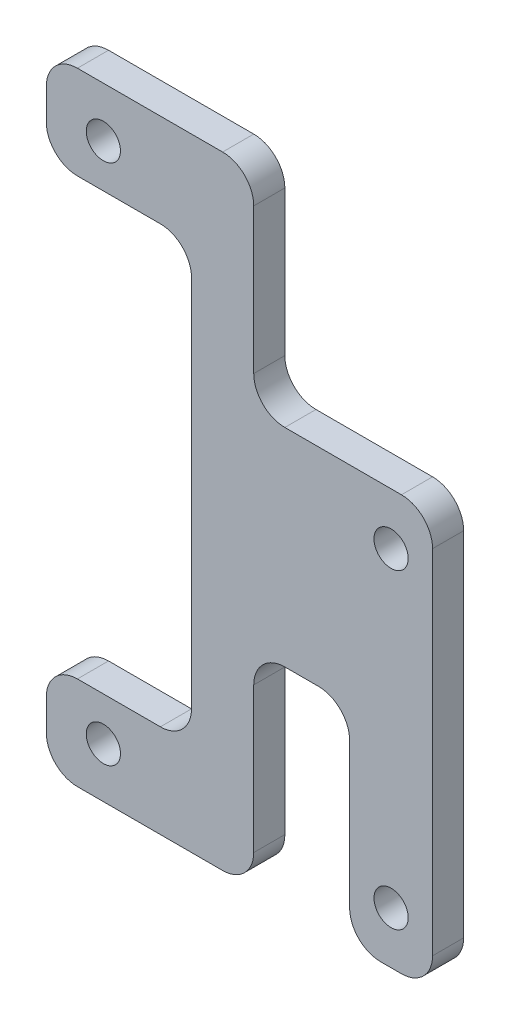
ISO-10303-21;
HEADER;
FILE_DESCRIPTION(('STEP AP214'),'2;1');
FILE_NAME('part.step','',(''),(''),'','','');
FILE_SCHEMA(('AUTOMOTIVE_DESIGN { 1 0 10303 214 1 1 1 1 }'));
ENDSEC;
DATA;
#1=APPLICATION_CONTEXT('core data for automotive mechanical design processes');
#2=APPLICATION_PROTOCOL_DEFINITION('international standard','automotive_design',2000,#1);
#3=PRODUCT_CONTEXT('',#1,'mechanical');
#4=PRODUCT('Part','Part','',(#3));
#5=PRODUCT_RELATED_PRODUCT_CATEGORY('part','',(#4));
#6=PRODUCT_DEFINITION_FORMATION('','',#4);
#7=PRODUCT_DEFINITION_CONTEXT('part definition',#1,'design');
#8=PRODUCT_DEFINITION('design','',#6,#7);
#9=PRODUCT_DEFINITION_SHAPE('','',#8);
#10=(LENGTH_UNIT() NAMED_UNIT(*) SI_UNIT(.MILLI.,.METRE.));
#11=(NAMED_UNIT(*) PLANE_ANGLE_UNIT() SI_UNIT($,.RADIAN.));
#12=(NAMED_UNIT(*) SI_UNIT($,.STERADIAN.) SOLID_ANGLE_UNIT());
#13=UNCERTAINTY_MEASURE_WITH_UNIT(LENGTH_MEASURE(1.E-05),#10,'distance_accuracy_value','');
#14=(GEOMETRIC_REPRESENTATION_CONTEXT(3) GLOBAL_UNCERTAINTY_ASSIGNED_CONTEXT((#13)) GLOBAL_UNIT_ASSIGNED_CONTEXT((#10,
#11,#12)) REPRESENTATION_CONTEXT('',''));
#15=CARTESIAN_POINT('',(0.,0.,0.));
#16=DIRECTION('',(0.,0.,1.));
#17=DIRECTION('',(1.,0.,0.));
#18=AXIS2_PLACEMENT_3D('',#15,#16,#17);
#19=CARTESIAN_POINT('',(-33.245,0.,0.));
#20=DIRECTION('',(-1.,0.,0.));
#21=DIRECTION('',(0.,-1.,0.));
#22=AXIS2_PLACEMENT_3D('',#19,#20,#21);
#23=PLANE('',#22);
#24=DIRECTION('',(0.,-1.,0.));
#25=VECTOR('',#24,1.);
#26=CARTESIAN_POINT('',(-33.245,40.,0.));
#27=LINE('',#26,#25);
#28=CARTESIAN_POINT('',(-33.245,37.,0.));
#29=VERTEX_POINT('',#28);
#30=CARTESIAN_POINT('',(-33.245,34.,0.));
#31=VERTEX_POINT('',#30);
#32=EDGE_CURVE('E429',#29,#31,#27,.T.);
#33=ORIENTED_EDGE('',*,*,#32,.T.);
#34=DIRECTION('',(0.,0.,-1.));
#35=VECTOR('',#34,1.);
#36=CARTESIAN_POINT('',(-33.245,34.,3.));
#37=LINE('',#36,#35);
#38=CARTESIAN_POINT('',(-33.245,34.,3.));
#39=VERTEX_POINT('',#38);
#40=EDGE_CURVE('E60',#31,#39,#37,.F.);
#41=ORIENTED_EDGE('',*,*,#40,.T.);
#42=DIRECTION('',(0.,1.,0.));
#43=VECTOR('',#42,1.);
#44=CARTESIAN_POINT('',(-33.245,40.,3.));
#45=LINE('',#44,#43);
#46=CARTESIAN_POINT('',(-33.245,37.,3.));
#47=VERTEX_POINT('',#46);
#48=EDGE_CURVE('E423',#39,#47,#45,.T.);
#49=ORIENTED_EDGE('',*,*,#48,.T.);
#50=DIRECTION('',(0.,0.,-1.));
#51=VECTOR('',#50,1.);
#52=CARTESIAN_POINT('',(-33.245,37.,0.));
#53=LINE('',#52,#51);
#54=EDGE_CURVE('E369',#47,#29,#53,.T.);
#55=ORIENTED_EDGE('',*,*,#54,.T.);
#56=EDGE_LOOP('',(#33,#41,#49,#55));
#57=FACE_BOUND('',#56,.T.);
#58=ADVANCED_FACE('F38',(#57),#23,.T.);
#59=CARTESIAN_POINT('',(-4.,20.,3.));
#60=DIRECTION('',(1.,0.,0.));
#61=DIRECTION('',(0.,1.,0.));
#62=AXIS2_PLACEMENT_3D('',#59,#60,#61);
#63=PLANE('',#62);
#64=DIRECTION('',(0.,-1.,0.));
#65=VECTOR('',#64,1.);
#66=CARTESIAN_POINT('',(-4.,20.,0.));
#67=LINE('',#66,#65);
#68=CARTESIAN_POINT('',(-4.,-3.,0.));
#69=VERTEX_POINT('',#68);
#70=CARTESIAN_POINT('',(-4.,-17.,0.));
#71=VERTEX_POINT('',#70);
#72=EDGE_CURVE('E256',#69,#71,#67,.T.);
#73=ORIENTED_EDGE('',*,*,#72,.T.);
#74=DIRECTION('',(0.,0.,-1.));
#75=VECTOR('',#74,1.);
#76=CARTESIAN_POINT('',(-4.,-17.,3.));
#77=LINE('',#76,#75);
#78=CARTESIAN_POINT('',(-4.,-17.,3.));
#79=VERTEX_POINT('',#78);
#80=EDGE_CURVE('E316',#71,#79,#77,.F.);
#81=ORIENTED_EDGE('',*,*,#80,.T.);
#82=DIRECTION('',(0.,-1.,0.));
#83=VECTOR('',#82,1.);
#84=CARTESIAN_POINT('',(-4.,20.,3.));
#85=LINE('',#84,#83);
#86=CARTESIAN_POINT('',(-4.,-3.,3.));
#87=VERTEX_POINT('',#86);
#88=EDGE_CURVE('E463',#87,#79,#85,.T.);
#89=ORIENTED_EDGE('',*,*,#88,.F.);
#90=DIRECTION('',(0.,0.,1.));
#91=VECTOR('',#90,1.);
#92=CARTESIAN_POINT('',(-4.,-3.,0.));
#93=LINE('',#92,#91);
#94=EDGE_CURVE('E314',#87,#69,#93,.F.);
#95=ORIENTED_EDGE('',*,*,#94,.T.);
#96=EDGE_LOOP('',(#73,#81,#89,#95));
#97=FACE_BOUND('',#96,.T.);
#98=ADVANCED_FACE('F477',(#97),#63,.F.);
#99=CARTESIAN_POINT('',(0.,0.,3.));
#100=DIRECTION('',(0.,0.,1.));
#101=DIRECTION('',(1.,0.,0.));
#102=AXIS2_PLACEMENT_3D('',#99,#100,#101);
#103=PLANE('',#102);
#104=CARTESIAN_POINT('',(-27.745,35.17,3.));
#105=DIRECTION('',(0.,0.,1.));
#106=DIRECTION('',(1.,0.,0.));
#107=AXIS2_PLACEMENT_3D('',#104,#105,#106);
#108=CIRCLE('',#107,1.65);
#109=CARTESIAN_POINT('',(-26.095,35.17,3.));
#110=VERTEX_POINT('',#109);
#111=EDGE_CURVE('E276',#110,#110,#108,.T.);
#112=ORIENTED_EDGE('',*,*,#111,.F.);
#113=EDGE_LOOP('',(#112));
#114=FACE_BOUND('',#113,.T.);
#115=CARTESIAN_POINT('',(-27.745,-15.17,3.));
#116=DIRECTION('',(0.,0.,1.));
#117=DIRECTION('',(-1.,0.,0.));
#118=AXIS2_PLACEMENT_3D('',#115,#116,#117);
#119=CIRCLE('',#118,1.65);
#120=CARTESIAN_POINT('',(-29.395,-15.17,3.));
#121=VERTEX_POINT('',#120);
#122=EDGE_CURVE('E531',#121,#121,#119,.T.);
#123=ORIENTED_EDGE('',*,*,#122,.F.);
#124=EDGE_LOOP('',(#123));
#125=FACE_BOUND('',#124,.T.);
#126=DIRECTION('',(1.,0.,0.));
#127=VECTOR('',#126,1.);
#128=CARTESIAN_POINT('',(-4.,-20.,3.));
#129=LINE('',#128,#127);
#130=CARTESIAN_POINT('',(-0.999999999999997,-20.,3.));
#131=VERTEX_POINT('',#130);
#132=CARTESIAN_POINT('',(1.,-20.,3.));
#133=VERTEX_POINT('',#132);
#134=EDGE_CURVE('E262',#131,#133,#129,.T.);
#135=ORIENTED_EDGE('',*,*,#134,.T.);
#136=CARTESIAN_POINT('',(1.,-17.,3.));
#137=DIRECTION('',(0.,0.,1.));
#138=DIRECTION('',(1.,0.,0.));
#139=AXIS2_PLACEMENT_3D('',#136,#137,#138);
#140=CIRCLE('',#139,3.);
#141=CARTESIAN_POINT('',(4.,-17.,3.));
#142=VERTEX_POINT('',#141);
#143=EDGE_CURVE('E312',#133,#142,#140,.T.);
#144=ORIENTED_EDGE('',*,*,#143,.T.);
#145=DIRECTION('',(0.,1.,0.));
#146=VECTOR('',#145,1.);
#147=CARTESIAN_POINT('',(4.,20.,3.));
#148=LINE('',#147,#146);
#149=CARTESIAN_POINT('',(4.,17.,3.));
#150=VERTEX_POINT('',#149);
#151=EDGE_CURVE('E244',#142,#150,#148,.T.);
#152=ORIENTED_EDGE('',*,*,#151,.T.);
#153=CARTESIAN_POINT('',(0.999999999999998,17.,3.));
#154=DIRECTION('',(0.,0.,1.));
#155=DIRECTION('',(1.,0.,0.));
#156=AXIS2_PLACEMENT_3D('',#153,#154,#155);
#157=CIRCLE('',#156,3.);
#158=CARTESIAN_POINT('',(0.999999999999998,20.,3.));
#159=VERTEX_POINT('',#158);
#160=EDGE_CURVE('E302',#150,#159,#157,.T.);
#161=ORIENTED_EDGE('',*,*,#160,.T.);
#162=DIRECTION('',(-1.,0.,0.));
#163=VECTOR('',#162,1.);
#164=CARTESIAN_POINT('',(-4.,20.,3.));
#165=LINE('',#164,#163);
#166=CARTESIAN_POINT('',(-10.245,20.,3.));
#167=VERTEX_POINT('',#166);
#168=EDGE_CURVE('E461',#159,#167,#165,.T.);
#169=ORIENTED_EDGE('',*,*,#168,.T.);
#170=CARTESIAN_POINT('',(-10.245,23.,3.));
#171=DIRECTION('',(0.,0.,1.));
#172=DIRECTION('',(1.,0.,0.));
#173=AXIS2_PLACEMENT_3D('',#170,#171,#172);
#174=CIRCLE('',#173,3.);
#175=CARTESIAN_POINT('',(-13.245,23.,3.));
#176=VERTEX_POINT('',#175);
#177=EDGE_CURVE('E387',#167,#176,#174,.F.);
#178=ORIENTED_EDGE('',*,*,#177,.T.);
#179=DIRECTION('',(0.,1.,0.));
#180=VECTOR('',#179,1.);
#181=CARTESIAN_POINT('',(-13.245,40.,3.));
#182=LINE('',#181,#180);
#183=CARTESIAN_POINT('',(-13.245,37.,3.));
#184=VERTEX_POINT('',#183);
#185=EDGE_CURVE('E413',#176,#184,#182,.T.);
#186=ORIENTED_EDGE('',*,*,#185,.T.);
#187=CARTESIAN_POINT('',(-16.245,37.,3.));
#188=DIRECTION('',(0.,0.,1.));
#189=DIRECTION('',(1.,0.,0.));
#190=AXIS2_PLACEMENT_3D('',#187,#188,#189);
#191=CIRCLE('',#190,3.);
#192=CARTESIAN_POINT('',(-16.245,40.,3.));
#193=VERTEX_POINT('',#192);
#194=EDGE_CURVE('E300',#184,#193,#191,.T.);
#195=ORIENTED_EDGE('',*,*,#194,.T.);
#196=DIRECTION('',(1.,0.,0.));
#197=VECTOR('',#196,1.);
#198=CARTESIAN_POINT('',(-33.245,40.,3.));
#199=LINE('',#198,#197);
#200=CARTESIAN_POINT('',(-30.245,40.,3.));
#201=VERTEX_POINT('',#200);
#202=EDGE_CURVE('E443',#201,#193,#199,.T.);
#203=ORIENTED_EDGE('',*,*,#202,.F.);
#204=CARTESIAN_POINT('',(-30.245,37.,3.));
#205=DIRECTION('',(0.,0.,1.));
#206=DIRECTION('',(1.,0.,0.));
#207=AXIS2_PLACEMENT_3D('',#204,#205,#206);
#208=CIRCLE('',#207,3.);
#209=EDGE_CURVE('E53',#201,#47,#208,.T.);
#210=ORIENTED_EDGE('',*,*,#209,.T.);
#211=ORIENTED_EDGE('',*,*,#48,.F.);
#212=CARTESIAN_POINT('',(-30.245,34.,3.));
#213=DIRECTION('',(0.,0.,1.));
#214=DIRECTION('',(1.,0.,0.));
#215=AXIS2_PLACEMENT_3D('',#212,#213,#214);
#216=CIRCLE('',#215,3.);
#217=CARTESIAN_POINT('',(-30.245,31.,3.));
#218=VERTEX_POINT('',#217);
#219=EDGE_CURVE('E298',#39,#218,#216,.T.);
#220=ORIENTED_EDGE('',*,*,#219,.T.);
#221=DIRECTION('',(-1.,0.,0.));
#222=VECTOR('',#221,1.);
#223=CARTESIAN_POINT('',(-33.245,31.,3.));
#224=LINE('',#223,#222);
#225=CARTESIAN_POINT('',(-22.245,31.,3.));
#226=VERTEX_POINT('',#225);
#227=EDGE_CURVE('E396',#226,#218,#224,.T.);
#228=ORIENTED_EDGE('',*,*,#227,.F.);
#229=CARTESIAN_POINT('',(-22.245,28.,3.));
#230=DIRECTION('',(0.,0.,1.));
#231=DIRECTION('',(1.,0.,0.));
#232=AXIS2_PLACEMENT_3D('',#229,#230,#231);
#233=CIRCLE('',#232,3.);
#234=CARTESIAN_POINT('',(-19.245,28.,3.));
#235=VERTEX_POINT('',#234);
#236=EDGE_CURVE('E46',#226,#235,#233,.F.);
#237=ORIENTED_EDGE('',*,*,#236,.T.);
#238=DIRECTION('',(0.,1.,0.));
#239=VECTOR('',#238,1.);
#240=CARTESIAN_POINT('',(-19.245,31.,3.));
#241=LINE('',#240,#239);
#242=CARTESIAN_POINT('',(-19.245,-7.99999999999996,3.));
#243=VERTEX_POINT('',#242);
#244=EDGE_CURVE('E394',#243,#235,#241,.T.);
#245=ORIENTED_EDGE('',*,*,#244,.F.);
#246=CARTESIAN_POINT('',(-22.245,-7.99999999999997,3.));
#247=DIRECTION('',(0.,0.,1.));
#248=DIRECTION('',(1.,0.,0.));
#249=AXIS2_PLACEMENT_3D('',#246,#247,#248);
#250=CIRCLE('',#249,3.);
#251=CARTESIAN_POINT('',(-22.245,-11.,3.));
#252=VERTEX_POINT('',#251);
#253=EDGE_CURVE('E381',#243,#252,#250,.F.);
#254=ORIENTED_EDGE('',*,*,#253,.T.);
#255=DIRECTION('',(1.,0.,0.));
#256=VECTOR('',#255,1.);
#257=CARTESIAN_POINT('',(-33.245,-11.,3.));
#258=LINE('',#257,#256);
#259=CARTESIAN_POINT('',(-30.245,-11.,3.));
#260=VERTEX_POINT('',#259);
#261=EDGE_CURVE('E279',#260,#252,#258,.T.);
#262=ORIENTED_EDGE('',*,*,#261,.F.);
#263=CARTESIAN_POINT('',(-30.245,-14.,3.));
#264=DIRECTION('',(0.,0.,1.));
#265=DIRECTION('',(1.,0.,0.));
#266=AXIS2_PLACEMENT_3D('',#263,#264,#265);
#267=CIRCLE('',#266,3.);
#268=CARTESIAN_POINT('',(-33.245,-14.,3.));
#269=VERTEX_POINT('',#268);
#270=EDGE_CURVE('E304',#260,#269,#267,.T.);
#271=ORIENTED_EDGE('',*,*,#270,.T.);
#272=CARTESIAN_POINT('',(-33.245,-17.,3.));
#273=VERTEX_POINT('',#272);
#274=EDGE_CURVE('E425',#273,#269,#45,.T.);
#275=ORIENTED_EDGE('',*,*,#274,.F.);
#276=CARTESIAN_POINT('',(-30.245,-17.,3.));
#277=DIRECTION('',(0.,0.,1.));
#278=DIRECTION('',(1.,0.,0.));
#279=AXIS2_PLACEMENT_3D('',#276,#277,#278);
#280=CIRCLE('',#279,3.);
#281=CARTESIAN_POINT('',(-30.245,-20.,3.));
#282=VERTEX_POINT('',#281);
#283=EDGE_CURVE('E306',#273,#282,#280,.T.);
#284=ORIENTED_EDGE('',*,*,#283,.T.);
#285=DIRECTION('',(1.,0.,0.));
#286=VECTOR('',#285,1.);
#287=CARTESIAN_POINT('',(-33.245,-20.,3.));
#288=LINE('',#287,#286);
#289=CARTESIAN_POINT('',(-16.245,-20.,3.));
#290=VERTEX_POINT('',#289);
#291=EDGE_CURVE('E434',#282,#290,#288,.T.);
#292=ORIENTED_EDGE('',*,*,#291,.T.);
#293=CARTESIAN_POINT('',(-16.245,-17.,3.));
#294=DIRECTION('',(0.,0.,1.));
#295=DIRECTION('',(1.,0.,0.));
#296=AXIS2_PLACEMENT_3D('',#293,#294,#295);
#297=CIRCLE('',#296,3.);
#298=CARTESIAN_POINT('',(-13.245,-17.,3.));
#299=VERTEX_POINT('',#298);
#300=EDGE_CURVE('E308',#290,#299,#297,.T.);
#301=ORIENTED_EDGE('',*,*,#300,.T.);
#302=CARTESIAN_POINT('',(-13.245,-3.,3.));
#303=VERTEX_POINT('',#302);
#304=EDGE_CURVE('E417',#299,#303,#182,.T.);
#305=ORIENTED_EDGE('',*,*,#304,.T.);
#306=CARTESIAN_POINT('',(-10.245,-3.,3.));
#307=DIRECTION('',(0.,0.,1.));
#308=DIRECTION('',(1.,0.,0.));
#309=AXIS2_PLACEMENT_3D('',#306,#307,#308);
#310=CIRCLE('',#309,3.);
#311=CARTESIAN_POINT('',(-10.245,0.,3.));
#312=VERTEX_POINT('',#311);
#313=EDGE_CURVE('E377',#303,#312,#310,.F.);
#314=ORIENTED_EDGE('',*,*,#313,.T.);
#315=DIRECTION('',(1.,0.,0.));
#316=VECTOR('',#315,1.);
#317=CARTESIAN_POINT('',(-13.245,0.,3.));
#318=LINE('',#317,#316);
#319=CARTESIAN_POINT('',(-7.,0.,3.));
#320=VERTEX_POINT('',#319);
#321=EDGE_CURVE('E446',#312,#320,#318,.T.);
#322=ORIENTED_EDGE('',*,*,#321,.T.);
#323=CARTESIAN_POINT('',(-7.,-3.,3.));
#324=DIRECTION('',(0.,0.,1.));
#325=DIRECTION('',(1.,0.,0.));
#326=AXIS2_PLACEMENT_3D('',#323,#324,#325);
#327=CIRCLE('',#326,3.);
#328=EDGE_CURVE('E373',#320,#87,#327,.F.);
#329=ORIENTED_EDGE('',*,*,#328,.T.);
#330=ORIENTED_EDGE('',*,*,#88,.T.);
#331=CARTESIAN_POINT('',(-0.999999999999997,-17.,3.));
#332=DIRECTION('',(0.,0.,1.));
#333=DIRECTION('',(1.,0.,0.));
#334=AXIS2_PLACEMENT_3D('',#331,#332,#333);
#335=CIRCLE('',#334,3.);
#336=EDGE_CURVE('E310',#79,#131,#335,.T.);
#337=ORIENTED_EDGE('',*,*,#336,.T.);
#338=EDGE_LOOP('',(#135,#144,#152,#161,#169,#178,#186,#195,#203,#210,#211,#220,#228,#237,#245,
#254,#262,#271,#275,#284,#292,#301,#305,#314,#322,#329,#330,#337));
#339=FACE_BOUND('',#338,.T.);
#340=CARTESIAN_POINT('',(0.,15.,3.));
#341=DIRECTION('',(0.,0.,1.));
#342=DIRECTION('',(1.,0.,0.));
#343=AXIS2_PLACEMENT_3D('',#340,#341,#342);
#344=CIRCLE('',#343,1.65);
#345=CARTESIAN_POINT('',(1.65,15.,3.));
#346=VERTEX_POINT('',#345);
#347=EDGE_CURVE('E253',#346,#346,#344,.T.);
#348=ORIENTED_EDGE('',*,*,#347,.F.);
#349=EDGE_LOOP('',(#348));
#350=FACE_BOUND('',#349,.T.);
#351=CARTESIAN_POINT('',(0.,-15.,3.));
#352=DIRECTION('',(0.,0.,1.));
#353=DIRECTION('',(-1.,0.,0.));
#354=AXIS2_PLACEMENT_3D('',#351,#352,#353);
#355=CIRCLE('',#354,1.65);
#356=CARTESIAN_POINT('',(-1.65,-15.,3.));
#357=VERTEX_POINT('',#356);
#358=EDGE_CURVE('E453',#357,#357,#355,.T.);
#359=ORIENTED_EDGE('',*,*,#358,.F.);
#360=EDGE_LOOP('',(#359));
#361=FACE_BOUND('',#360,.T.);
#362=ADVANCED_FACE('F392',(#114,#125,#339,#350,#361),#103,.T.);
#363=CARTESIAN_POINT('',(0.,0.,0.));
#364=DIRECTION('',(0.,0.,1.));
#365=DIRECTION('',(1.,0.,0.));
#366=AXIS2_PLACEMENT_3D('',#363,#364,#365);
#367=PLANE('',#366);
#368=CARTESIAN_POINT('',(-27.745,35.17,0.));
#369=DIRECTION('',(0.,0.,1.));
#370=DIRECTION('',(1.,0.,0.));
#371=AXIS2_PLACEMENT_3D('',#368,#369,#370);
#372=CIRCLE('',#371,1.65);
#373=CARTESIAN_POINT('',(-26.095,35.17,0.));
#374=VERTEX_POINT('',#373);
#375=EDGE_CURVE('E275',#374,#374,#372,.T.);
#376=ORIENTED_EDGE('',*,*,#375,.T.);
#377=EDGE_LOOP('',(#376));
#378=FACE_BOUND('',#377,.T.);
#379=CARTESIAN_POINT('',(-27.745,-15.17,0.));
#380=DIRECTION('',(0.,0.,1.));
#381=DIRECTION('',(1.,0.,0.));
#382=AXIS2_PLACEMENT_3D('',#379,#380,#381);
#383=CIRCLE('',#382,1.65);
#384=CARTESIAN_POINT('',(-26.095,-15.17,0.));
#385=VERTEX_POINT('',#384);
#386=EDGE_CURVE('E272',#385,#385,#383,.T.);
#387=ORIENTED_EDGE('',*,*,#386,.T.);
#388=EDGE_LOOP('',(#387));
#389=FACE_BOUND('',#388,.T.);
#390=DIRECTION('',(0.,1.,0.));
#391=VECTOR('',#390,1.);
#392=CARTESIAN_POINT('',(4.,20.,0.));
#393=LINE('',#392,#391);
#394=CARTESIAN_POINT('',(4.,-17.,0.));
#395=VERTEX_POINT('',#394);
#396=CARTESIAN_POINT('',(4.,17.,0.));
#397=VERTEX_POINT('',#396);
#398=EDGE_CURVE('E241',#395,#397,#393,.T.);
#399=ORIENTED_EDGE('',*,*,#398,.F.);
#400=CARTESIAN_POINT('',(1.,-17.,0.));
#401=DIRECTION('',(0.,0.,1.));
#402=DIRECTION('',(1.,0.,0.));
#403=AXIS2_PLACEMENT_3D('',#400,#401,#402);
#404=CIRCLE('',#403,3.);
#405=CARTESIAN_POINT('',(1.,-20.,0.));
#406=VERTEX_POINT('',#405);
#407=EDGE_CURVE('E224',#395,#406,#404,.F.);
#408=ORIENTED_EDGE('',*,*,#407,.T.);
#409=DIRECTION('',(1.,0.,0.));
#410=VECTOR('',#409,1.);
#411=CARTESIAN_POINT('',(-4.,-20.,0.));
#412=LINE('',#411,#410);
#413=CARTESIAN_POINT('',(-0.999999999999997,-20.,0.));
#414=VERTEX_POINT('',#413);
#415=EDGE_CURVE('E267',#414,#406,#412,.T.);
#416=ORIENTED_EDGE('',*,*,#415,.F.);
#417=CARTESIAN_POINT('',(-0.999999999999997,-17.,0.));
#418=DIRECTION('',(0.,0.,1.));
#419=DIRECTION('',(1.,0.,0.));
#420=AXIS2_PLACEMENT_3D('',#417,#418,#419);
#421=CIRCLE('',#420,3.);
#422=EDGE_CURVE('E235',#414,#71,#421,.F.);
#423=ORIENTED_EDGE('',*,*,#422,.T.);
#424=ORIENTED_EDGE('',*,*,#72,.F.);
#425=CARTESIAN_POINT('',(-7.,-3.,0.));
#426=DIRECTION('',(0.,0.,1.));
#427=DIRECTION('',(1.,0.,0.));
#428=AXIS2_PLACEMENT_3D('',#425,#426,#427);
#429=CIRCLE('',#428,3.);
#430=CARTESIAN_POINT('',(-7.,0.,0.));
#431=VERTEX_POINT('',#430);
#432=EDGE_CURVE('E375',#69,#431,#429,.T.);
#433=ORIENTED_EDGE('',*,*,#432,.T.);
#434=DIRECTION('',(1.,0.,0.));
#435=VECTOR('',#434,1.);
#436=CARTESIAN_POINT('',(-13.245,0.,0.));
#437=LINE('',#436,#435);
#438=CARTESIAN_POINT('',(-10.245,0.,0.));
#439=VERTEX_POINT('',#438);
#440=EDGE_CURVE('E449',#439,#431,#437,.T.);
#441=ORIENTED_EDGE('',*,*,#440,.F.);
#442=CARTESIAN_POINT('',(-10.245,-3.,0.));
#443=DIRECTION('',(0.,0.,1.));
#444=DIRECTION('',(1.,0.,0.));
#445=AXIS2_PLACEMENT_3D('',#442,#443,#444);
#446=CIRCLE('',#445,3.);
#447=CARTESIAN_POINT('',(-13.245,-3.,0.));
#448=VERTEX_POINT('',#447);
#449=EDGE_CURVE('E379',#439,#448,#446,.T.);
#450=ORIENTED_EDGE('',*,*,#449,.T.);
#451=DIRECTION('',(0.,-1.,0.));
#452=VECTOR('',#451,1.);
#453=CARTESIAN_POINT('',(-13.245,40.,0.));
#454=LINE('',#453,#452);
#455=CARTESIAN_POINT('',(-13.245,-17.,0.));
#456=VERTEX_POINT('',#455);
#457=EDGE_CURVE('E431',#448,#456,#454,.T.);
#458=ORIENTED_EDGE('',*,*,#457,.T.);
#459=CARTESIAN_POINT('',(-16.245,-17.,0.));
#460=DIRECTION('',(0.,0.,1.));
#461=DIRECTION('',(1.,0.,0.));
#462=AXIS2_PLACEMENT_3D('',#459,#460,#461);
#463=CIRCLE('',#462,3.);
#464=CARTESIAN_POINT('',(-16.245,-20.,0.));
#465=VERTEX_POINT('',#464);
#466=EDGE_CURVE('E291',#456,#465,#463,.F.);
#467=ORIENTED_EDGE('',*,*,#466,.T.);
#468=DIRECTION('',(1.,0.,0.));
#469=VECTOR('',#468,1.);
#470=CARTESIAN_POINT('',(-33.245,-20.,0.));
#471=LINE('',#470,#469);
#472=CARTESIAN_POINT('',(-30.245,-20.,0.));
#473=VERTEX_POINT('',#472);
#474=EDGE_CURVE('E437',#473,#465,#471,.T.);
#475=ORIENTED_EDGE('',*,*,#474,.F.);
#476=CARTESIAN_POINT('',(-30.245,-17.,0.));
#477=DIRECTION('',(0.,0.,1.));
#478=DIRECTION('',(1.,0.,0.));
#479=AXIS2_PLACEMENT_3D('',#476,#477,#478);
#480=CIRCLE('',#479,3.);
#481=CARTESIAN_POINT('',(-33.245,-17.,0.));
#482=VERTEX_POINT('',#481);
#483=EDGE_CURVE('E289',#473,#482,#480,.F.);
#484=ORIENTED_EDGE('',*,*,#483,.T.);
#485=CARTESIAN_POINT('',(-33.245,-14.,0.));
#486=VERTEX_POINT('',#485);
#487=EDGE_CURVE('E427',#486,#482,#27,.T.);
#488=ORIENTED_EDGE('',*,*,#487,.F.);
#489=CARTESIAN_POINT('',(-30.245,-14.,0.));
#490=DIRECTION('',(0.,0.,1.));
#491=DIRECTION('',(1.,0.,0.));
#492=AXIS2_PLACEMENT_3D('',#489,#490,#491);
#493=CIRCLE('',#492,3.);
#494=CARTESIAN_POINT('',(-30.245,-11.,0.));
#495=VERTEX_POINT('',#494);
#496=EDGE_CURVE('E287',#486,#495,#493,.F.);
#497=ORIENTED_EDGE('',*,*,#496,.T.);
#498=DIRECTION('',(1.,0.,0.));
#499=VECTOR('',#498,1.);
#500=CARTESIAN_POINT('',(0.,-11.,0.));
#501=LINE('',#500,#499);
#502=CARTESIAN_POINT('',(-22.245,-11.,0.));
#503=VERTEX_POINT('',#502);
#504=EDGE_CURVE('E414',#495,#503,#501,.T.);
#505=ORIENTED_EDGE('',*,*,#504,.T.);
#506=CARTESIAN_POINT('',(-22.245,-7.99999999999997,0.));
#507=DIRECTION('',(0.,0.,1.));
#508=DIRECTION('',(1.,0.,0.));
#509=AXIS2_PLACEMENT_3D('',#506,#507,#508);
#510=CIRCLE('',#509,3.);
#511=CARTESIAN_POINT('',(-19.245,-7.99999999999997,0.));
#512=VERTEX_POINT('',#511);
#513=EDGE_CURVE('E383',#503,#512,#510,.T.);
#514=ORIENTED_EDGE('',*,*,#513,.T.);
#515=DIRECTION('',(0.,1.,0.));
#516=VECTOR('',#515,1.);
#517=CARTESIAN_POINT('',(-19.245,0.,0.));
#518=LINE('',#517,#516);
#519=CARTESIAN_POINT('',(-19.245,28.,0.));
#520=VERTEX_POINT('',#519);
#521=EDGE_CURVE('E269',#512,#520,#518,.T.);
#522=ORIENTED_EDGE('',*,*,#521,.T.);
#523=CARTESIAN_POINT('',(-22.245,28.,0.));
#524=DIRECTION('',(0.,0.,1.));
#525=DIRECTION('',(1.,0.,0.));
#526=AXIS2_PLACEMENT_3D('',#523,#524,#525);
#527=CIRCLE('',#526,3.);
#528=CARTESIAN_POINT('',(-22.245,31.,0.));
#529=VERTEX_POINT('',#528);
#530=EDGE_CURVE('E11',#520,#529,#527,.T.);
#531=ORIENTED_EDGE('',*,*,#530,.T.);
#532=DIRECTION('',(-1.,0.,0.));
#533=VECTOR('',#532,1.);
#534=CARTESIAN_POINT('',(0.,31.,0.));
#535=LINE('',#534,#533);
#536=CARTESIAN_POINT('',(-30.245,31.,0.));
#537=VERTEX_POINT('',#536);
#538=EDGE_CURVE('E409',#529,#537,#535,.T.);
#539=ORIENTED_EDGE('',*,*,#538,.T.);
#540=CARTESIAN_POINT('',(-30.245,34.,0.));
#541=DIRECTION('',(0.,0.,1.));
#542=DIRECTION('',(1.,0.,0.));
#543=AXIS2_PLACEMENT_3D('',#540,#541,#542);
#544=CIRCLE('',#543,3.);
#545=EDGE_CURVE('E282',#537,#31,#544,.F.);
#546=ORIENTED_EDGE('',*,*,#545,.T.);
#547=ORIENTED_EDGE('',*,*,#32,.F.);
#548=CARTESIAN_POINT('',(-30.245,37.,0.));
#549=DIRECTION('',(0.,0.,1.));
#550=DIRECTION('',(1.,0.,0.));
#551=AXIS2_PLACEMENT_3D('',#548,#549,#550);
#552=CIRCLE('',#551,3.);
#553=CARTESIAN_POINT('',(-30.245,40.,0.));
#554=VERTEX_POINT('',#553);
#555=EDGE_CURVE('E245',#29,#554,#552,.F.);
#556=ORIENTED_EDGE('',*,*,#555,.T.);
#557=DIRECTION('',(1.,0.,0.));
#558=VECTOR('',#557,1.);
#559=CARTESIAN_POINT('',(-33.245,40.,0.));
#560=LINE('',#559,#558);
#561=CARTESIAN_POINT('',(-16.245,40.,0.));
#562=VERTEX_POINT('',#561);
#563=EDGE_CURVE('E440',#554,#562,#560,.T.);
#564=ORIENTED_EDGE('',*,*,#563,.T.);
#565=CARTESIAN_POINT('',(-16.245,37.,0.));
#566=DIRECTION('',(0.,0.,1.));
#567=DIRECTION('',(1.,0.,0.));
#568=AXIS2_PLACEMENT_3D('',#565,#566,#567);
#569=CIRCLE('',#568,3.);
#570=CARTESIAN_POINT('',(-13.245,37.,0.));
#571=VERTEX_POINT('',#570);
#572=EDGE_CURVE('E284',#562,#571,#569,.F.);
#573=ORIENTED_EDGE('',*,*,#572,.T.);
#574=CARTESIAN_POINT('',(-13.245,23.,0.));
#575=VERTEX_POINT('',#574);
#576=EDGE_CURVE('E426',#571,#575,#454,.T.);
#577=ORIENTED_EDGE('',*,*,#576,.T.);
#578=CARTESIAN_POINT('',(-10.245,23.,0.));
#579=DIRECTION('',(0.,0.,1.));
#580=DIRECTION('',(1.,0.,0.));
#581=AXIS2_PLACEMENT_3D('',#578,#579,#580);
#582=CIRCLE('',#581,3.);
#583=CARTESIAN_POINT('',(-10.245,20.,0.));
#584=VERTEX_POINT('',#583);
#585=EDGE_CURVE('E385',#575,#584,#582,.T.);
#586=ORIENTED_EDGE('',*,*,#585,.T.);
#587=DIRECTION('',(-1.,0.,0.));
#588=VECTOR('',#587,1.);
#589=CARTESIAN_POINT('',(-4.,20.,0.));
#590=LINE('',#589,#588);
#591=CARTESIAN_POINT('',(0.999999999999998,20.,0.));
#592=VERTEX_POINT('',#591);
#593=EDGE_CURVE('E252',#592,#584,#590,.T.);
#594=ORIENTED_EDGE('',*,*,#593,.F.);
#595=CARTESIAN_POINT('',(0.999999999999998,17.,0.));
#596=DIRECTION('',(0.,0.,1.));
#597=DIRECTION('',(1.,0.,0.));
#598=AXIS2_PLACEMENT_3D('',#595,#596,#597);
#599=CIRCLE('',#598,3.);
#600=EDGE_CURVE('E251',#592,#397,#599,.F.);
#601=ORIENTED_EDGE('',*,*,#600,.T.);
#602=EDGE_LOOP('',(#399,#408,#416,#423,#424,#433,#441,#450,#458,#467,#475,#484,#488,#497,#505,
#514,#522,#531,#539,#546,#547,#556,#564,#573,#577,#586,#594,#601));
#603=FACE_BOUND('',#602,.T.);
#604=CARTESIAN_POINT('',(0.,15.,0.));
#605=DIRECTION('',(0.,0.,1.));
#606=DIRECTION('',(1.,0.,0.));
#607=AXIS2_PLACEMENT_3D('',#604,#605,#606);
#608=CIRCLE('',#607,1.65);
#609=CARTESIAN_POINT('',(1.65,15.,0.));
#610=VERTEX_POINT('',#609);
#611=EDGE_CURVE('E259',#610,#610,#608,.T.);
#612=ORIENTED_EDGE('',*,*,#611,.T.);
#613=EDGE_LOOP('',(#612));
#614=FACE_BOUND('',#613,.T.);
#615=CARTESIAN_POINT('',(0.,-15.,0.));
#616=DIRECTION('',(0.,0.,1.));
#617=DIRECTION('',(-1.,0.,0.));
#618=AXIS2_PLACEMENT_3D('',#615,#616,#617);
#619=CIRCLE('',#618,1.65);
#620=CARTESIAN_POINT('',(-1.65,-15.,0.));
#621=VERTEX_POINT('',#620);
#622=EDGE_CURVE('E452',#621,#621,#619,.T.);
#623=ORIENTED_EDGE('',*,*,#622,.T.);
#624=EDGE_LOOP('',(#623));
#625=FACE_BOUND('',#624,.T.);
#626=ADVANCED_FACE('F248',(#378,#389,#603,#614,#625),#367,.F.);
#627=CARTESIAN_POINT('',(4.,20.,3.));
#628=DIRECTION('',(-1.,0.,0.));
#629=DIRECTION('',(0.,-1.,0.));
#630=AXIS2_PLACEMENT_3D('',#627,#628,#629);
#631=PLANE('',#630);
#632=ORIENTED_EDGE('',*,*,#151,.F.);
#633=DIRECTION('',(0.,0.,-1.));
#634=VECTOR('',#633,1.);
#635=CARTESIAN_POINT('',(4.,-17.,3.));
#636=LINE('',#635,#634);
#637=EDGE_CURVE('E228',#142,#395,#636,.T.);
#638=ORIENTED_EDGE('',*,*,#637,.T.);
#639=ORIENTED_EDGE('',*,*,#398,.T.);
#640=DIRECTION('',(0.,0.,-1.));
#641=VECTOR('',#640,1.);
#642=CARTESIAN_POINT('',(4.,17.,3.));
#643=LINE('',#642,#641);
#644=EDGE_CURVE('E246',#397,#150,#643,.F.);
#645=ORIENTED_EDGE('',*,*,#644,.T.);
#646=EDGE_LOOP('',(#632,#638,#639,#645));
#647=FACE_BOUND('',#646,.T.);
#648=ADVANCED_FACE('F240',(#647),#631,.F.);
#649=CARTESIAN_POINT('',(-4.,20.,3.));
#650=DIRECTION('',(0.,-1.,0.));
#651=DIRECTION('',(0.,0.,-1.));
#652=AXIS2_PLACEMENT_3D('',#649,#650,#651);
#653=PLANE('',#652);
#654=ORIENTED_EDGE('',*,*,#168,.F.);
#655=DIRECTION('',(0.,0.,-1.));
#656=VECTOR('',#655,1.);
#657=CARTESIAN_POINT('',(0.999999999999998,20.,3.));
#658=LINE('',#657,#656);
#659=EDGE_CURVE('E350',#159,#592,#658,.T.);
#660=ORIENTED_EDGE('',*,*,#659,.T.);
#661=ORIENTED_EDGE('',*,*,#593,.T.);
#662=DIRECTION('',(0.,0.,-1.));
#663=VECTOR('',#662,1.);
#664=CARTESIAN_POINT('',(-10.245,20.,3.));
#665=LINE('',#664,#663);
#666=EDGE_CURVE('E348',#584,#167,#665,.F.);
#667=ORIENTED_EDGE('',*,*,#666,.T.);
#668=EDGE_LOOP('',(#654,#660,#661,#667));
#669=FACE_BOUND('',#668,.T.);
#670=ADVANCED_FACE('F560',(#669),#653,.F.);
#671=CARTESIAN_POINT('',(-4.,-20.,3.));
#672=DIRECTION('',(0.,1.,0.));
#673=DIRECTION('',(0.,0.,1.));
#674=AXIS2_PLACEMENT_3D('',#671,#672,#673);
#675=PLANE('',#674);
#676=ORIENTED_EDGE('',*,*,#415,.T.);
#677=DIRECTION('',(0.,0.,-1.));
#678=VECTOR('',#677,1.);
#679=CARTESIAN_POINT('',(1.,-20.,3.));
#680=LINE('',#679,#678);
#681=EDGE_CURVE('E229',#406,#133,#680,.F.);
#682=ORIENTED_EDGE('',*,*,#681,.T.);
#683=ORIENTED_EDGE('',*,*,#134,.F.);
#684=DIRECTION('',(0.,0.,-1.));
#685=VECTOR('',#684,1.);
#686=CARTESIAN_POINT('',(-0.999999999999997,-20.,3.));
#687=LINE('',#686,#685);
#688=EDGE_CURVE('E234',#131,#414,#687,.T.);
#689=ORIENTED_EDGE('',*,*,#688,.T.);
#690=EDGE_LOOP('',(#676,#682,#683,#689));
#691=FACE_BOUND('',#690,.T.);
#692=ADVANCED_FACE('F470',(#691),#675,.F.);
#693=CARTESIAN_POINT('',(0.,15.,3.));
#694=DIRECTION('',(0.,0.,-1.));
#695=DIRECTION('',(-1.,0.,0.));
#696=AXIS2_PLACEMENT_3D('',#693,#694,#695);
#697=CYLINDRICAL_SURFACE('',#696,1.65);
#698=ORIENTED_EDGE('',*,*,#347,.T.);
#699=EDGE_LOOP('',(#698));
#700=FACE_BOUND('',#699,.T.);
#701=ORIENTED_EDGE('',*,*,#611,.F.);
#702=EDGE_LOOP('',(#701));
#703=FACE_BOUND('',#702,.T.);
#704=ADVANCED_FACE('F598',(#700,#703),#697,.F.);
#705=CARTESIAN_POINT('',(0.,-15.,3.));
#706=DIRECTION('',(0.,0.,-1.));
#707=DIRECTION('',(-1.,0.,0.));
#708=AXIS2_PLACEMENT_3D('',#705,#706,#707);
#709=CYLINDRICAL_SURFACE('',#708,1.65);
#710=ORIENTED_EDGE('',*,*,#358,.T.);
#711=EDGE_LOOP('',(#710));
#712=FACE_BOUND('',#711,.T.);
#713=ORIENTED_EDGE('',*,*,#622,.F.);
#714=EDGE_LOOP('',(#713));
#715=FACE_BOUND('',#714,.T.);
#716=ADVANCED_FACE('F595',(#712,#715),#709,.F.);
#717=CARTESIAN_POINT('',(-13.245,0.,0.));
#718=DIRECTION('',(0.,1.,0.));
#719=DIRECTION('',(-1.,0.,0.));
#720=AXIS2_PLACEMENT_3D('',#717,#718,#719);
#721=PLANE('',#720);
#722=ORIENTED_EDGE('',*,*,#440,.T.);
#723=DIRECTION('',(0.,0.,1.));
#724=VECTOR('',#723,1.);
#725=CARTESIAN_POINT('',(-7.,0.,3.));
#726=LINE('',#725,#724);
#727=EDGE_CURVE('E320',#431,#320,#726,.T.);
#728=ORIENTED_EDGE('',*,*,#727,.T.);
#729=ORIENTED_EDGE('',*,*,#321,.F.);
#730=DIRECTION('',(0.,0.,1.));
#731=VECTOR('',#730,1.);
#732=CARTESIAN_POINT('',(-10.245,0.,0.));
#733=LINE('',#732,#731);
#734=EDGE_CURVE('E318',#312,#439,#733,.F.);
#735=ORIENTED_EDGE('',*,*,#734,.T.);
#736=EDGE_LOOP('',(#722,#728,#729,#735));
#737=FACE_BOUND('',#736,.T.);
#738=ADVANCED_FACE('F485',(#737),#721,.F.);
#739=CARTESIAN_POINT('',(-13.245,0.,0.));
#740=DIRECTION('',(-1.,0.,0.));
#741=DIRECTION('',(0.,-1.,0.));
#742=AXIS2_PLACEMENT_3D('',#739,#740,#741);
#743=PLANE('',#742);
#744=ORIENTED_EDGE('',*,*,#457,.F.);
#745=DIRECTION('',(0.,0.,1.));
#746=VECTOR('',#745,1.);
#747=CARTESIAN_POINT('',(-13.245,-3.,3.));
#748=LINE('',#747,#746);
#749=EDGE_CURVE('E325',#448,#303,#748,.T.);
#750=ORIENTED_EDGE('',*,*,#749,.T.);
#751=ORIENTED_EDGE('',*,*,#304,.F.);
#752=DIRECTION('',(0.,0.,1.));
#753=VECTOR('',#752,1.);
#754=CARTESIAN_POINT('',(-13.245,-17.,0.));
#755=LINE('',#754,#753);
#756=EDGE_CURVE('E323',#299,#456,#755,.F.);
#757=ORIENTED_EDGE('',*,*,#756,.T.);
#758=EDGE_LOOP('',(#744,#750,#751,#757));
#759=FACE_BOUND('',#758,.T.);
#760=ADVANCED_FACE('F494',(#759),#743,.F.);
#761=ORIENTED_EDGE('',*,*,#185,.F.);
#762=DIRECTION('',(0.,0.,-1.));
#763=VECTOR('',#762,1.);
#764=CARTESIAN_POINT('',(-13.245,23.,0.));
#765=LINE('',#764,#763);
#766=EDGE_CURVE('E355',#176,#575,#765,.T.);
#767=ORIENTED_EDGE('',*,*,#766,.T.);
#768=ORIENTED_EDGE('',*,*,#576,.F.);
#769=DIRECTION('',(0.,0.,-1.));
#770=VECTOR('',#769,1.);
#771=CARTESIAN_POINT('',(-13.245,37.,0.));
#772=LINE('',#771,#770);
#773=EDGE_CURVE('E353',#571,#184,#772,.F.);
#774=ORIENTED_EDGE('',*,*,#773,.T.);
#775=EDGE_LOOP('',(#761,#767,#768,#774));
#776=FACE_BOUND('',#775,.T.);
#777=ADVANCED_FACE('F552',(#776),#743,.F.);
#778=CARTESIAN_POINT('',(-33.245,40.,0.));
#779=DIRECTION('',(0.,-1.,0.));
#780=DIRECTION('',(1.,0.,0.));
#781=AXIS2_PLACEMENT_3D('',#778,#779,#780);
#782=PLANE('',#781);
#783=ORIENTED_EDGE('',*,*,#202,.T.);
#784=DIRECTION('',(0.,0.,-1.));
#785=VECTOR('',#784,1.);
#786=CARTESIAN_POINT('',(-16.245,40.,0.));
#787=LINE('',#786,#785);
#788=EDGE_CURVE('E360',#193,#562,#787,.T.);
#789=ORIENTED_EDGE('',*,*,#788,.T.);
#790=ORIENTED_EDGE('',*,*,#563,.F.);
#791=DIRECTION('',(0.,0.,-1.));
#792=VECTOR('',#791,1.);
#793=CARTESIAN_POINT('',(-30.245,40.,3.));
#794=LINE('',#793,#792);
#795=EDGE_CURVE('E358',#554,#201,#794,.F.);
#796=ORIENTED_EDGE('',*,*,#795,.T.);
#797=EDGE_LOOP('',(#783,#789,#790,#796));
#798=FACE_BOUND('',#797,.T.);
#799=ADVANCED_FACE('F542',(#798),#782,.F.);
#800=CARTESIAN_POINT('',(-33.245,-20.,0.));
#801=DIRECTION('',(0.,1.,0.));
#802=DIRECTION('',(-1.,0.,0.));
#803=AXIS2_PLACEMENT_3D('',#800,#801,#802);
#804=PLANE('',#803);
#805=ORIENTED_EDGE('',*,*,#474,.T.);
#806=DIRECTION('',(0.,0.,1.));
#807=VECTOR('',#806,1.);
#808=CARTESIAN_POINT('',(-16.245,-20.,0.));
#809=LINE('',#808,#807);
#810=EDGE_CURVE('E330',#465,#290,#809,.T.);
#811=ORIENTED_EDGE('',*,*,#810,.T.);
#812=ORIENTED_EDGE('',*,*,#291,.F.);
#813=DIRECTION('',(0.,0.,1.));
#814=VECTOR('',#813,1.);
#815=CARTESIAN_POINT('',(-30.245,-20.,0.));
#816=LINE('',#815,#814);
#817=EDGE_CURVE('E328',#282,#473,#816,.F.);
#818=ORIENTED_EDGE('',*,*,#817,.T.);
#819=EDGE_LOOP('',(#805,#811,#812,#818));
#820=FACE_BOUND('',#819,.T.);
#821=ADVANCED_FACE('F504',(#820),#804,.F.);
#822=ORIENTED_EDGE('',*,*,#487,.T.);
#823=DIRECTION('',(0.,0.,1.));
#824=VECTOR('',#823,1.);
#825=CARTESIAN_POINT('',(-33.245,-17.,3.));
#826=LINE('',#825,#824);
#827=EDGE_CURVE('E335',#482,#273,#826,.T.);
#828=ORIENTED_EDGE('',*,*,#827,.T.);
#829=ORIENTED_EDGE('',*,*,#274,.T.);
#830=DIRECTION('',(0.,0.,1.));
#831=VECTOR('',#830,1.);
#832=CARTESIAN_POINT('',(-33.245,-14.,0.));
#833=LINE('',#832,#831);
#834=EDGE_CURVE('E333',#269,#486,#833,.F.);
#835=ORIENTED_EDGE('',*,*,#834,.T.);
#836=EDGE_LOOP('',(#822,#828,#829,#835));
#837=FACE_BOUND('',#836,.T.);
#838=ADVANCED_FACE('F513',(#837),#23,.T.);
#839=CARTESIAN_POINT('',(-19.245,31.,-7.));
#840=DIRECTION('',(1.,0.,0.));
#841=DIRECTION('',(0.,0.,-1.));
#842=AXIS2_PLACEMENT_3D('',#839,#840,#841);
#843=PLANE('',#842);
#844=ORIENTED_EDGE('',*,*,#521,.F.);
#845=DIRECTION('',(0.,0.,1.));
#846=VECTOR('',#845,1.);
#847=CARTESIAN_POINT('',(-19.245,-7.99999999999997,3.));
#848=LINE('',#847,#846);
#849=EDGE_CURVE('E345',#512,#243,#848,.T.);
#850=ORIENTED_EDGE('',*,*,#849,.T.);
#851=ORIENTED_EDGE('',*,*,#244,.T.);
#852=DIRECTION('',(0.,0.,1.));
#853=VECTOR('',#852,1.);
#854=CARTESIAN_POINT('',(-19.245,28.,0.));
#855=LINE('',#854,#853);
#856=EDGE_CURVE('E343',#235,#520,#855,.F.);
#857=ORIENTED_EDGE('',*,*,#856,.T.);
#858=EDGE_LOOP('',(#844,#850,#851,#857));
#859=FACE_BOUND('',#858,.T.);
#860=ADVANCED_FACE('F402',(#859),#843,.F.);
#861=CARTESIAN_POINT('',(-33.245,31.,-7.));
#862=DIRECTION('',(0.,1.,0.));
#863=DIRECTION('',(0.,0.,1.));
#864=AXIS2_PLACEMENT_3D('',#861,#862,#863);
#865=PLANE('',#864);
#866=ORIENTED_EDGE('',*,*,#538,.F.);
#867=DIRECTION('',(0.,0.,1.));
#868=VECTOR('',#867,1.);
#869=CARTESIAN_POINT('',(-22.245,31.,3.));
#870=LINE('',#869,#868);
#871=EDGE_CURVE('E366',#529,#226,#870,.T.);
#872=ORIENTED_EDGE('',*,*,#871,.T.);
#873=ORIENTED_EDGE('',*,*,#227,.T.);
#874=DIRECTION('',(0.,0.,-1.));
#875=VECTOR('',#874,1.);
#876=CARTESIAN_POINT('',(-30.245,31.,0.));
#877=LINE('',#876,#875);
#878=EDGE_CURVE('E363',#218,#537,#877,.T.);
#879=ORIENTED_EDGE('',*,*,#878,.T.);
#880=EDGE_LOOP('',(#866,#872,#873,#879));
#881=FACE_BOUND('',#880,.T.);
#882=ADVANCED_FACE('F411',(#881),#865,.F.);
#883=CARTESIAN_POINT('',(-33.245,-11.,-7.));
#884=DIRECTION('',(0.,-1.,0.));
#885=DIRECTION('',(0.,0.,-1.));
#886=AXIS2_PLACEMENT_3D('',#883,#884,#885);
#887=PLANE('',#886);
#888=ORIENTED_EDGE('',*,*,#504,.F.);
#889=DIRECTION('',(0.,0.,1.));
#890=VECTOR('',#889,1.);
#891=CARTESIAN_POINT('',(-30.245,-11.,3.));
#892=LINE('',#891,#890);
#893=EDGE_CURVE('E340',#495,#260,#892,.T.);
#894=ORIENTED_EDGE('',*,*,#893,.T.);
#895=ORIENTED_EDGE('',*,*,#261,.T.);
#896=DIRECTION('',(0.,0.,1.));
#897=VECTOR('',#896,1.);
#898=CARTESIAN_POINT('',(-22.245,-11.,0.));
#899=LINE('',#898,#897);
#900=EDGE_CURVE('E338',#252,#503,#899,.F.);
#901=ORIENTED_EDGE('',*,*,#900,.T.);
#902=EDGE_LOOP('',(#888,#894,#895,#901));
#903=FACE_BOUND('',#902,.T.);
#904=ADVANCED_FACE('F523',(#903),#887,.F.);
#905=CARTESIAN_POINT('',(-27.745,-15.17,-7.));
#906=DIRECTION('',(0.,0.,1.));
#907=DIRECTION('',(1.,0.,0.));
#908=AXIS2_PLACEMENT_3D('',#905,#906,#907);
#909=CYLINDRICAL_SURFACE('',#908,1.65);
#910=ORIENTED_EDGE('',*,*,#122,.T.);
#911=EDGE_LOOP('',(#910));
#912=FACE_BOUND('',#911,.T.);
#913=ORIENTED_EDGE('',*,*,#386,.F.);
#914=EDGE_LOOP('',(#913));
#915=FACE_BOUND('',#914,.T.);
#916=ADVANCED_FACE('F739',(#912,#915),#909,.F.);
#917=CARTESIAN_POINT('',(-27.745,35.17,-7.));
#918=DIRECTION('',(0.,0.,1.));
#919=DIRECTION('',(1.,0.,0.));
#920=AXIS2_PLACEMENT_3D('',#917,#918,#919);
#921=CYLINDRICAL_SURFACE('',#920,1.65);
#922=ORIENTED_EDGE('',*,*,#111,.T.);
#923=EDGE_LOOP('',(#922));
#924=FACE_BOUND('',#923,.T.);
#925=ORIENTED_EDGE('',*,*,#375,.F.);
#926=EDGE_LOOP('',(#925));
#927=FACE_BOUND('',#926,.T.);
#928=ADVANCED_FACE('F617',(#924,#927),#921,.F.);
#929=CARTESIAN_POINT('',(1.,-17.,3.));
#930=DIRECTION('',(0.,0.,-1.));
#931=DIRECTION('',(-1.,0.,0.));
#932=AXIS2_PLACEMENT_3D('',#929,#930,#931);
#933=CYLINDRICAL_SURFACE('',#932,3.);
#934=ORIENTED_EDGE('',*,*,#143,.F.);
#935=ORIENTED_EDGE('',*,*,#681,.F.);
#936=ORIENTED_EDGE('',*,*,#407,.F.);
#937=ORIENTED_EDGE('',*,*,#637,.F.);
#938=EDGE_LOOP('',(#934,#935,#936,#937));
#939=FACE_BOUND('',#938,.T.);
#940=ADVANCED_FACE('F227',(#939),#933,.T.);
#941=CARTESIAN_POINT('',(-0.999999999999997,-17.,3.));
#942=DIRECTION('',(0.,0.,-1.));
#943=DIRECTION('',(-1.,0.,0.));
#944=AXIS2_PLACEMENT_3D('',#941,#942,#943);
#945=CYLINDRICAL_SURFACE('',#944,3.);
#946=ORIENTED_EDGE('',*,*,#336,.F.);
#947=ORIENTED_EDGE('',*,*,#80,.F.);
#948=ORIENTED_EDGE('',*,*,#422,.F.);
#949=ORIENTED_EDGE('',*,*,#688,.F.);
#950=EDGE_LOOP('',(#946,#947,#948,#949));
#951=FACE_BOUND('',#950,.T.);
#952=ADVANCED_FACE('F472',(#951),#945,.T.);
#953=CARTESIAN_POINT('',(-7.,-3.,0.));
#954=DIRECTION('',(0.,0.,-1.));
#955=DIRECTION('',(-1.,0.,0.));
#956=AXIS2_PLACEMENT_3D('',#953,#954,#955);
#957=CYLINDRICAL_SURFACE('',#956,3.);
#958=ORIENTED_EDGE('',*,*,#432,.F.);
#959=ORIENTED_EDGE('',*,*,#94,.F.);
#960=ORIENTED_EDGE('',*,*,#328,.F.);
#961=ORIENTED_EDGE('',*,*,#727,.F.);
#962=EDGE_LOOP('',(#958,#959,#960,#961));
#963=FACE_BOUND('',#962,.T.);
#964=ADVANCED_FACE('F480',(#963),#957,.F.);
#965=CARTESIAN_POINT('',(-10.245,-3.,0.));
#966=DIRECTION('',(0.,0.,-1.));
#967=DIRECTION('',(-1.,0.,0.));
#968=AXIS2_PLACEMENT_3D('',#965,#966,#967);
#969=CYLINDRICAL_SURFACE('',#968,3.);
#970=ORIENTED_EDGE('',*,*,#449,.F.);
#971=ORIENTED_EDGE('',*,*,#734,.F.);
#972=ORIENTED_EDGE('',*,*,#313,.F.);
#973=ORIENTED_EDGE('',*,*,#749,.F.);
#974=EDGE_LOOP('',(#970,#971,#972,#973));
#975=FACE_BOUND('',#974,.T.);
#976=ADVANCED_FACE('F489',(#975),#969,.F.);
#977=CARTESIAN_POINT('',(-16.245,-17.,0.));
#978=DIRECTION('',(0.,0.,1.));
#979=DIRECTION('',(1.,0.,0.));
#980=AXIS2_PLACEMENT_3D('',#977,#978,#979);
#981=CYLINDRICAL_SURFACE('',#980,3.);
#982=ORIENTED_EDGE('',*,*,#466,.F.);
#983=ORIENTED_EDGE('',*,*,#756,.F.);
#984=ORIENTED_EDGE('',*,*,#300,.F.);
#985=ORIENTED_EDGE('',*,*,#810,.F.);
#986=EDGE_LOOP('',(#982,#983,#984,#985));
#987=FACE_BOUND('',#986,.T.);
#988=ADVANCED_FACE('F499',(#987),#981,.T.);
#989=CARTESIAN_POINT('',(-30.245,-17.,0.));
#990=DIRECTION('',(0.,0.,-1.));
#991=DIRECTION('',(-1.,0.,0.));
#992=AXIS2_PLACEMENT_3D('',#989,#990,#991);
#993=CYLINDRICAL_SURFACE('',#992,3.);
#994=ORIENTED_EDGE('',*,*,#483,.F.);
#995=ORIENTED_EDGE('',*,*,#817,.F.);
#996=ORIENTED_EDGE('',*,*,#283,.F.);
#997=ORIENTED_EDGE('',*,*,#827,.F.);
#998=EDGE_LOOP('',(#994,#995,#996,#997));
#999=FACE_BOUND('',#998,.T.);
#1000=ADVANCED_FACE('F508',(#999),#993,.T.);
#1001=CARTESIAN_POINT('',(-30.245,-14.,-7.));
#1002=DIRECTION('',(0.,0.,-1.));
#1003=DIRECTION('',(-1.,0.,0.));
#1004=AXIS2_PLACEMENT_3D('',#1001,#1002,#1003);
#1005=CYLINDRICAL_SURFACE('',#1004,3.);
#1006=ORIENTED_EDGE('',*,*,#496,.F.);
#1007=ORIENTED_EDGE('',*,*,#834,.F.);
#1008=ORIENTED_EDGE('',*,*,#270,.F.);
#1009=ORIENTED_EDGE('',*,*,#893,.F.);
#1010=EDGE_LOOP('',(#1006,#1007,#1008,#1009));
#1011=FACE_BOUND('',#1010,.T.);
#1012=ADVANCED_FACE('F518',(#1011),#1005,.T.);
#1013=CARTESIAN_POINT('',(-22.245,-7.99999999999997,-7.));
#1014=DIRECTION('',(0.,0.,-1.));
#1015=DIRECTION('',(-1.,0.,0.));
#1016=AXIS2_PLACEMENT_3D('',#1013,#1014,#1015);
#1017=CYLINDRICAL_SURFACE('',#1016,3.);
#1018=ORIENTED_EDGE('',*,*,#513,.F.);
#1019=ORIENTED_EDGE('',*,*,#900,.F.);
#1020=ORIENTED_EDGE('',*,*,#253,.F.);
#1021=ORIENTED_EDGE('',*,*,#849,.F.);
#1022=EDGE_LOOP('',(#1018,#1019,#1020,#1021));
#1023=FACE_BOUND('',#1022,.T.);
#1024=ADVANCED_FACE('F528',(#1023),#1017,.F.);
#1025=CARTESIAN_POINT('',(0.999999999999998,17.,3.));
#1026=DIRECTION('',(0.,0.,-1.));
#1027=DIRECTION('',(-1.,0.,0.));
#1028=AXIS2_PLACEMENT_3D('',#1025,#1026,#1027);
#1029=CYLINDRICAL_SURFACE('',#1028,3.);
#1030=ORIENTED_EDGE('',*,*,#160,.F.);
#1031=ORIENTED_EDGE('',*,*,#644,.F.);
#1032=ORIENTED_EDGE('',*,*,#600,.F.);
#1033=ORIENTED_EDGE('',*,*,#659,.F.);
#1034=EDGE_LOOP('',(#1030,#1031,#1032,#1033));
#1035=FACE_BOUND('',#1034,.T.);
#1036=ADVANCED_FACE('F564',(#1035),#1029,.T.);
#1037=CARTESIAN_POINT('',(-10.245,23.,0.));
#1038=DIRECTION('',(0.,0.,1.));
#1039=DIRECTION('',(1.,0.,0.));
#1040=AXIS2_PLACEMENT_3D('',#1037,#1038,#1039);
#1041=CYLINDRICAL_SURFACE('',#1040,3.);
#1042=ORIENTED_EDGE('',*,*,#177,.F.);
#1043=ORIENTED_EDGE('',*,*,#666,.F.);
#1044=ORIENTED_EDGE('',*,*,#585,.F.);
#1045=ORIENTED_EDGE('',*,*,#766,.F.);
#1046=EDGE_LOOP('',(#1042,#1043,#1044,#1045));
#1047=FACE_BOUND('',#1046,.T.);
#1048=ADVANCED_FACE('F556',(#1047),#1041,.F.);
#1049=CARTESIAN_POINT('',(-16.245,37.,0.));
#1050=DIRECTION('',(0.,0.,-1.));
#1051=DIRECTION('',(-1.,0.,0.));
#1052=AXIS2_PLACEMENT_3D('',#1049,#1050,#1051);
#1053=CYLINDRICAL_SURFACE('',#1052,3.);
#1054=ORIENTED_EDGE('',*,*,#194,.F.);
#1055=ORIENTED_EDGE('',*,*,#773,.F.);
#1056=ORIENTED_EDGE('',*,*,#572,.F.);
#1057=ORIENTED_EDGE('',*,*,#788,.F.);
#1058=EDGE_LOOP('',(#1054,#1055,#1056,#1057));
#1059=FACE_BOUND('',#1058,.T.);
#1060=ADVANCED_FACE('F546',(#1059),#1053,.T.);
#1061=CARTESIAN_POINT('',(-22.245,28.,-7.));
#1062=DIRECTION('',(0.,0.,-1.));
#1063=DIRECTION('',(-1.,0.,0.));
#1064=AXIS2_PLACEMENT_3D('',#1061,#1062,#1063);
#1065=CYLINDRICAL_SURFACE('',#1064,3.);
#1066=ORIENTED_EDGE('',*,*,#530,.F.);
#1067=ORIENTED_EDGE('',*,*,#856,.F.);
#1068=ORIENTED_EDGE('',*,*,#236,.F.);
#1069=ORIENTED_EDGE('',*,*,#871,.F.);
#1070=EDGE_LOOP('',(#1066,#1067,#1068,#1069));
#1071=FACE_BOUND('',#1070,.T.);
#1072=ADVANCED_FACE('F406',(#1071),#1065,.F.);
#1073=CARTESIAN_POINT('',(-30.245,34.,-7.));
#1074=DIRECTION('',(0.,0.,1.));
#1075=DIRECTION('',(1.,0.,0.));
#1076=AXIS2_PLACEMENT_3D('',#1073,#1074,#1075);
#1077=CYLINDRICAL_SURFACE('',#1076,3.);
#1078=ORIENTED_EDGE('',*,*,#219,.F.);
#1079=ORIENTED_EDGE('',*,*,#40,.F.);
#1080=ORIENTED_EDGE('',*,*,#545,.F.);
#1081=ORIENTED_EDGE('',*,*,#878,.F.);
#1082=EDGE_LOOP('',(#1078,#1079,#1080,#1081));
#1083=FACE_BOUND('',#1082,.T.);
#1084=ADVANCED_FACE('F535',(#1083),#1077,.T.);
#1085=CARTESIAN_POINT('',(-30.245,37.,0.));
#1086=DIRECTION('',(0.,0.,1.));
#1087=DIRECTION('',(1.,0.,0.));
#1088=AXIS2_PLACEMENT_3D('',#1085,#1086,#1087);
#1089=CYLINDRICAL_SURFACE('',#1088,3.);
#1090=ORIENTED_EDGE('',*,*,#209,.F.);
#1091=ORIENTED_EDGE('',*,*,#795,.F.);
#1092=ORIENTED_EDGE('',*,*,#555,.F.);
#1093=ORIENTED_EDGE('',*,*,#54,.F.);
#1094=EDGE_LOOP('',(#1090,#1091,#1092,#1093));
#1095=FACE_BOUND('',#1094,.T.);
#1096=ADVANCED_FACE('F40',(#1095),#1089,.T.);
#1097=CLOSED_SHELL('',(#58,#98,#362,#626,#648,#670,#692,#704,#716,#738,#760,#777,#799,#821,#838,
#860,#882,#904,#916,#928,#940,#952,#964,#976,#988,#1000,#1012,#1024,#1036,#1048,#1060,#1072,
#1084,#1096));
#1098=MANIFOLD_SOLID_BREP('B2',#1097);
#1099=ADVANCED_BREP_SHAPE_REPRESENTATION('',(#18,#1098),#14);
#1100=SHAPE_DEFINITION_REPRESENTATION(#9,#1099);
ENDSEC;
END-ISO-10303-21;
